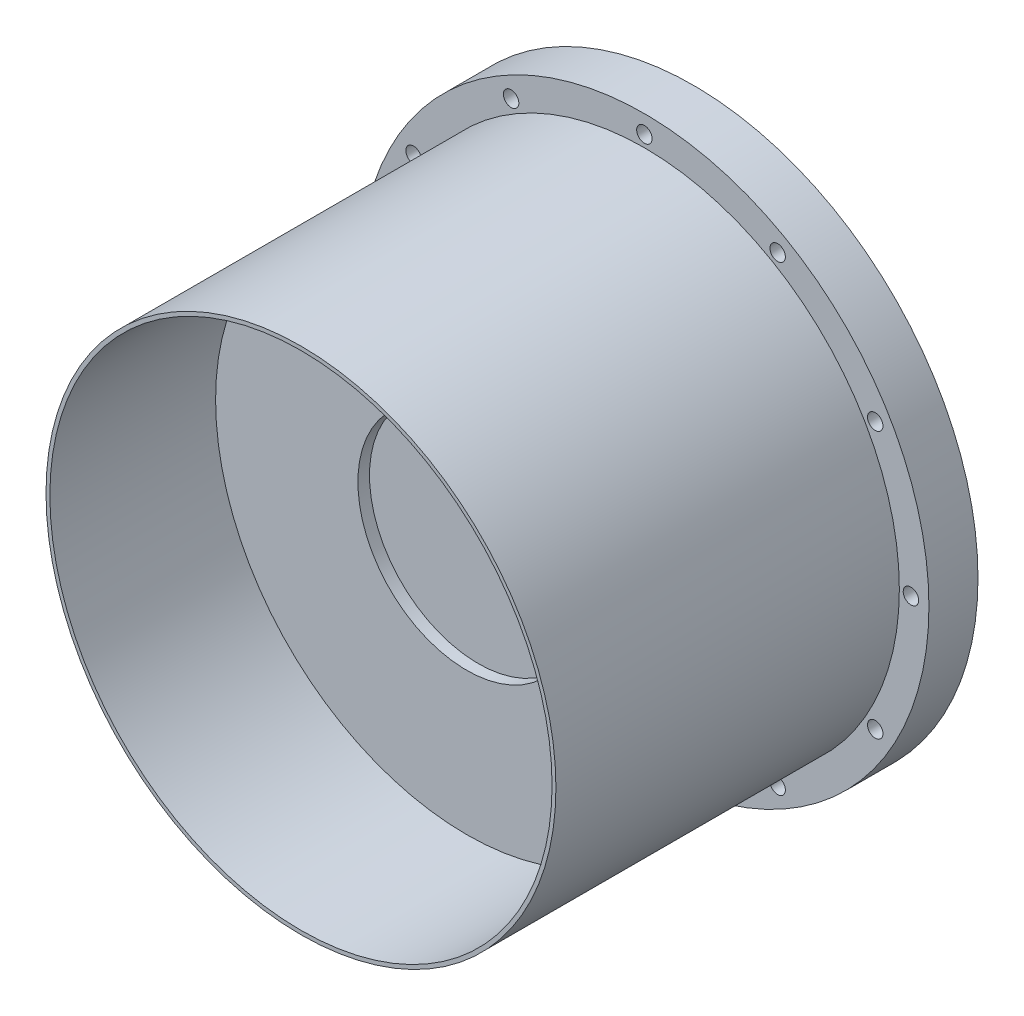
ISO-10303-21;
HEADER;
FILE_DESCRIPTION(('STEP AP214'),'2;1');
FILE_NAME('part.step','',(''),(''),'','','');
FILE_SCHEMA(('AUTOMOTIVE_DESIGN { 1 0 10303 214 1 1 1 1 }'));
ENDSEC;
DATA;
#1=APPLICATION_CONTEXT('core data for automotive mechanical design processes');
#2=APPLICATION_PROTOCOL_DEFINITION('international standard','automotive_design',2000,#1);
#3=PRODUCT_CONTEXT('',#1,'mechanical');
#4=PRODUCT('Part','Part','',(#3));
#5=PRODUCT_RELATED_PRODUCT_CATEGORY('part','',(#4));
#6=PRODUCT_DEFINITION_FORMATION('','',#4);
#7=PRODUCT_DEFINITION_CONTEXT('part definition',#1,'design');
#8=PRODUCT_DEFINITION('design','',#6,#7);
#9=PRODUCT_DEFINITION_SHAPE('','',#8);
#10=(LENGTH_UNIT() NAMED_UNIT(*) SI_UNIT(.MILLI.,.METRE.));
#11=(NAMED_UNIT(*) PLANE_ANGLE_UNIT() SI_UNIT($,.RADIAN.));
#12=(NAMED_UNIT(*) SI_UNIT($,.STERADIAN.) SOLID_ANGLE_UNIT());
#13=UNCERTAINTY_MEASURE_WITH_UNIT(LENGTH_MEASURE(1.E-05),#10,'distance_accuracy_value','');
#14=(GEOMETRIC_REPRESENTATION_CONTEXT(3) GLOBAL_UNCERTAINTY_ASSIGNED_CONTEXT((#13)) GLOBAL_UNIT_ASSIGNED_CONTEXT((#10,
#11,#12)) REPRESENTATION_CONTEXT('',''));
#15=CARTESIAN_POINT('',(0.,0.,0.));
#16=DIRECTION('',(0.,0.,1.));
#17=DIRECTION('',(1.,0.,0.));
#18=AXIS2_PLACEMENT_3D('',#15,#16,#17);
#19=CARTESIAN_POINT('',(0.,0.,12.7));
#20=DIRECTION('',(0.,0.,-1.));
#21=DIRECTION('',(-1.,0.,0.));
#22=AXIS2_PLACEMENT_3D('',#19,#20,#21);
#23=CYLINDRICAL_SURFACE('',#22,73.66);
#24=CARTESIAN_POINT('',(0.,0.,12.7));
#25=DIRECTION('',(0.,0.,1.));
#26=DIRECTION('',(1.,0.,0.));
#27=AXIS2_PLACEMENT_3D('',#24,#25,#26);
#28=CIRCLE('',#27,73.66);
#29=CARTESIAN_POINT('',(73.66,0.,12.7));
#30=VERTEX_POINT('',#29);
#31=EDGE_CURVE('E58',#30,#30,#28,.T.);
#32=ORIENTED_EDGE('',*,*,#31,.F.);
#33=EDGE_LOOP('',(#32));
#34=FACE_BOUND('',#33,.T.);
#35=CARTESIAN_POINT('',(0.,0.,0.));
#36=DIRECTION('',(0.,0.,1.));
#37=DIRECTION('',(1.,0.,0.));
#38=AXIS2_PLACEMENT_3D('',#35,#36,#37);
#39=CIRCLE('',#38,73.66);
#40=CARTESIAN_POINT('',(73.66,0.,0.));
#41=VERTEX_POINT('',#40);
#42=EDGE_CURVE('E59',#41,#41,#39,.T.);
#43=ORIENTED_EDGE('',*,*,#42,.T.);
#44=EDGE_LOOP('',(#43));
#45=FACE_BOUND('',#44,.T.);
#46=ADVANCED_FACE('F39',(#34,#45),#23,.T.);
#47=CARTESIAN_POINT('',(0.,0.,12.7));
#48=DIRECTION('',(0.,0.,1.));
#49=DIRECTION('',(1.,0.,0.));
#50=AXIS2_PLACEMENT_3D('',#47,#48,#49);
#51=PLANE('',#50);
#52=CARTESIAN_POINT('',(0.,0.,12.7));
#53=DIRECTION('',(0.,0.,1.));
#54=DIRECTION('',(1.,0.,0.));
#55=AXIS2_PLACEMENT_3D('',#52,#53,#54);
#56=CIRCLE('',#55,66.);
#57=CARTESIAN_POINT('',(66.,0.,12.7));
#58=VERTEX_POINT('',#57);
#59=EDGE_CURVE('E163',#58,#58,#56,.T.);
#60=ORIENTED_EDGE('',*,*,#59,.F.);
#61=EDGE_LOOP('',(#60));
#62=FACE_BOUND('',#61,.T.);
#63=CARTESIAN_POINT('',(0.,69.,12.7));
#64=DIRECTION('',(0.,0.,1.));
#65=DIRECTION('',(1.,0.,0.));
#66=AXIS2_PLACEMENT_3D('',#63,#64,#65);
#67=CIRCLE('',#66,2.);
#68=CARTESIAN_POINT('',(2.,69.,12.7));
#69=VERTEX_POINT('',#68);
#70=EDGE_CURVE('E100',#69,#69,#67,.T.);
#71=ORIENTED_EDGE('',*,*,#70,.F.);
#72=EDGE_LOOP('',(#71));
#73=FACE_BOUND('',#72,.T.);
#74=CARTESIAN_POINT('',(-34.4999999999992,59.7557528611267,12.7));
#75=DIRECTION('',(0.,0.,1.));
#76=DIRECTION('',(1.,0.,0.));
#77=AXIS2_PLACEMENT_3D('',#74,#75,#76);
#78=CIRCLE('',#77,2.);
#79=CARTESIAN_POINT('',(-32.4999999999992,59.7557528611267,12.7));
#80=VERTEX_POINT('',#79);
#81=EDGE_CURVE('E133',#80,#80,#78,.T.);
#82=ORIENTED_EDGE('',*,*,#81,.F.);
#83=EDGE_LOOP('',(#82));
#84=FACE_BOUND('',#83,.T.);
#85=CARTESIAN_POINT('',(-59.7557528611253,34.4999999999983,12.7));
#86=DIRECTION('',(0.,0.,1.));
#87=DIRECTION('',(1.,0.,0.));
#88=AXIS2_PLACEMENT_3D('',#85,#86,#87);
#89=CIRCLE('',#88,2.00000000000225);
#90=CARTESIAN_POINT('',(-57.7557528611231,34.4999999999983,12.7));
#91=VERTEX_POINT('',#90);
#92=EDGE_CURVE('E142',#91,#91,#89,.T.);
#93=ORIENTED_EDGE('',*,*,#92,.F.);
#94=EDGE_LOOP('',(#93));
#95=FACE_BOUND('',#94,.T.);
#96=CARTESIAN_POINT('',(-68.9999999999981,-1.95687291924082E-12,12.7));
#97=DIRECTION('',(0.,0.,1.));
#98=DIRECTION('',(1.,0.,0.));
#99=AXIS2_PLACEMENT_3D('',#96,#97,#98);
#100=CIRCLE('',#99,2.00000000000313);
#101=CARTESIAN_POINT('',(-66.9999999999949,-1.95687291924082E-12,12.7));
#102=VERTEX_POINT('',#101);
#103=EDGE_CURVE('E150',#102,#102,#100,.T.);
#104=ORIENTED_EDGE('',*,*,#103,.F.);
#105=EDGE_LOOP('',(#104));
#106=FACE_BOUND('',#105,.T.);
#107=CARTESIAN_POINT('',(34.5000000000001,59.7557528611262,12.7));
#108=DIRECTION('',(0.,0.,1.));
#109=DIRECTION('',(1.,0.,0.));
#110=AXIS2_PLACEMENT_3D('',#107,#108,#109);
#111=CIRCLE('',#110,2.);
#112=CARTESIAN_POINT('',(36.5000000000001,59.7557528611262,12.7));
#113=VERTEX_POINT('',#112);
#114=EDGE_CURVE('E92',#113,#113,#111,.T.);
#115=ORIENTED_EDGE('',*,*,#114,.F.);
#116=EDGE_LOOP('',(#115));
#117=FACE_BOUND('',#116,.T.);
#118=CARTESIAN_POINT('',(59.7557528611272,34.5000000000017,12.7));
#119=DIRECTION('',(0.,0.,1.));
#120=DIRECTION('',(1.,0.,0.));
#121=AXIS2_PLACEMENT_3D('',#118,#119,#120);
#122=CIRCLE('',#121,2.00000000000061);
#123=CARTESIAN_POINT('',(61.7557528611278,34.5000000000017,12.7));
#124=VERTEX_POINT('',#123);
#125=EDGE_CURVE('E84',#124,#124,#122,.T.);
#126=ORIENTED_EDGE('',*,*,#125,.F.);
#127=EDGE_LOOP('',(#126));
#128=FACE_BOUND('',#127,.T.);
#129=CARTESIAN_POINT('',(69.0000000000019,1.9484228563267E-12,12.7));
#130=DIRECTION('',(0.,0.,1.));
#131=DIRECTION('',(1.,0.,0.));
#132=AXIS2_PLACEMENT_3D('',#129,#130,#131);
#133=CIRCLE('',#132,2.00000000000153);
#134=CARTESIAN_POINT('',(71.0000000000035,1.9484228563267E-12,12.7));
#135=VERTEX_POINT('',#134);
#136=EDGE_CURVE('E76',#135,#135,#133,.T.);
#137=ORIENTED_EDGE('',*,*,#136,.F.);
#138=EDGE_LOOP('',(#137));
#139=FACE_BOUND('',#138,.T.);
#140=CARTESIAN_POINT('',(59.7557528611292,-34.4999999999983,12.7));
#141=DIRECTION('',(0.,0.,1.));
#142=DIRECTION('',(1.,0.,0.));
#143=AXIS2_PLACEMENT_3D('',#140,#141,#142);
#144=CIRCLE('',#143,2.00000000000263);
#145=CARTESIAN_POINT('',(61.7557528611318,-34.4999999999983,12.7));
#146=VERTEX_POINT('',#145);
#147=EDGE_CURVE('E67',#146,#146,#144,.T.);
#148=ORIENTED_EDGE('',*,*,#147,.F.);
#149=EDGE_LOOP('',(#148));
#150=FACE_BOUND('',#149,.T.);
#151=CARTESIAN_POINT('',(34.5000000000037,-59.7557528611253,12.7));
#152=DIRECTION('',(0.,0.,1.));
#153=DIRECTION('',(1.,0.,0.));
#154=AXIS2_PLACEMENT_3D('',#151,#152,#153);
#155=CIRCLE('',#154,2.0000000000036);
#156=CARTESIAN_POINT('',(36.5000000000073,-59.7557528611253,12.7));
#157=VERTEX_POINT('',#156);
#158=EDGE_CURVE('E126',#157,#157,#155,.T.);
#159=ORIENTED_EDGE('',*,*,#158,.F.);
#160=EDGE_LOOP('',(#159));
#161=FACE_BOUND('',#160,.T.);
#162=CARTESIAN_POINT('',(3.8968457126534E-12,-69.,12.7));
#163=DIRECTION('',(0.,0.,1.));
#164=DIRECTION('',(1.,0.,0.));
#165=AXIS2_PLACEMENT_3D('',#162,#163,#164);
#166=CIRCLE('',#165,2.00000000000419);
#167=CARTESIAN_POINT('',(2.00000000000808,-69.,12.7));
#168=VERTEX_POINT('',#167);
#169=EDGE_CURVE('E118',#168,#168,#166,.T.);
#170=ORIENTED_EDGE('',*,*,#169,.F.);
#171=EDGE_LOOP('',(#170));
#172=FACE_BOUND('',#171,.T.);
#173=CARTESIAN_POINT('',(-34.4999999999964,-59.7557528611273,12.7));
#174=DIRECTION('',(0.,0.,1.));
#175=DIRECTION('',(1.,0.,0.));
#176=AXIS2_PLACEMENT_3D('',#173,#174,#175);
#177=CIRCLE('',#176,2.00000000000432);
#178=CARTESIAN_POINT('',(-32.499999999992,-59.7557528611273,12.7));
#179=VERTEX_POINT('',#178);
#180=EDGE_CURVE('E110',#179,#179,#177,.T.);
#181=ORIENTED_EDGE('',*,*,#180,.F.);
#182=EDGE_LOOP('',(#181));
#183=FACE_BOUND('',#182,.T.);
#184=CARTESIAN_POINT('',(-59.7557528611233,-34.5000000000017,12.7));
#185=DIRECTION('',(0.,0.,1.));
#186=DIRECTION('',(1.,0.,0.));
#187=AXIS2_PLACEMENT_3D('',#184,#185,#186);
#188=CIRCLE('',#187,2.00000000000392);
#189=CARTESIAN_POINT('',(-57.7557528611194,-34.5000000000017,12.7));
#190=VERTEX_POINT('',#189);
#191=EDGE_CURVE('E101',#190,#190,#188,.T.);
#192=ORIENTED_EDGE('',*,*,#191,.F.);
#193=EDGE_LOOP('',(#192));
#194=FACE_BOUND('',#193,.T.);
#195=ORIENTED_EDGE('',*,*,#31,.T.);
#196=EDGE_LOOP('',(#195));
#197=FACE_BOUND('',#196,.T.);
#198=ADVANCED_FACE('F224',(#62,#73,#84,#95,#106,#117,#128,#139,#150,#161,#172,#183,#194,#197),
#51,.T.);
#199=CARTESIAN_POINT('',(0.,0.,0.));
#200=DIRECTION('',(0.,0.,1.));
#201=DIRECTION('',(1.,0.,0.));
#202=AXIS2_PLACEMENT_3D('',#199,#200,#201);
#203=PLANE('',#202);
#204=CARTESIAN_POINT('',(0.,0.,0.));
#205=DIRECTION('',(0.,0.,1.));
#206=DIRECTION('',(1.,0.,0.));
#207=AXIS2_PLACEMENT_3D('',#204,#205,#206);
#208=CIRCLE('',#207,28.1625528981699);
#209=CARTESIAN_POINT('',(28.1625528981699,0.,0.));
#210=VERTEX_POINT('',#209);
#211=EDGE_CURVE('E42',#210,#210,#208,.T.);
#212=ORIENTED_EDGE('',*,*,#211,.T.);
#213=EDGE_LOOP('',(#212));
#214=FACE_BOUND('',#213,.T.);
#215=CARTESIAN_POINT('',(0.,69.,0.));
#216=DIRECTION('',(0.,0.,1.));
#217=DIRECTION('',(1.,0.,0.));
#218=AXIS2_PLACEMENT_3D('',#215,#216,#217);
#219=CIRCLE('',#218,2.);
#220=CARTESIAN_POINT('',(2.,69.,0.));
#221=VERTEX_POINT('',#220);
#222=EDGE_CURVE('E63',#221,#221,#219,.T.);
#223=ORIENTED_EDGE('',*,*,#222,.T.);
#224=EDGE_LOOP('',(#223));
#225=FACE_BOUND('',#224,.T.);
#226=CARTESIAN_POINT('',(-34.4999999999992,59.7557528611267,0.));
#227=DIRECTION('',(0.,0.,1.));
#228=DIRECTION('',(1.,0.,0.));
#229=AXIS2_PLACEMENT_3D('',#226,#227,#228);
#230=CIRCLE('',#229,2.);
#231=CARTESIAN_POINT('',(-32.4999999999992,59.7557528611267,0.));
#232=VERTEX_POINT('',#231);
#233=EDGE_CURVE('E137',#232,#232,#230,.T.);
#234=ORIENTED_EDGE('',*,*,#233,.T.);
#235=EDGE_LOOP('',(#234));
#236=FACE_BOUND('',#235,.T.);
#237=CARTESIAN_POINT('',(-59.7557528611253,34.4999999999983,0.));
#238=DIRECTION('',(0.,0.,1.));
#239=DIRECTION('',(1.,0.,0.));
#240=AXIS2_PLACEMENT_3D('',#237,#238,#239);
#241=CIRCLE('',#240,2.00000000000225);
#242=CARTESIAN_POINT('',(-57.7557528611231,34.4999999999983,0.));
#243=VERTEX_POINT('',#242);
#244=EDGE_CURVE('E146',#243,#243,#241,.T.);
#245=ORIENTED_EDGE('',*,*,#244,.T.);
#246=EDGE_LOOP('',(#245));
#247=FACE_BOUND('',#246,.T.);
#248=CARTESIAN_POINT('',(-68.9999999999981,-1.95687291924082E-12,0.));
#249=DIRECTION('',(0.,0.,1.));
#250=DIRECTION('',(1.,0.,0.));
#251=AXIS2_PLACEMENT_3D('',#248,#249,#250);
#252=CIRCLE('',#251,2.00000000000313);
#253=CARTESIAN_POINT('',(-66.9999999999949,-1.95687291924082E-12,0.));
#254=VERTEX_POINT('',#253);
#255=EDGE_CURVE('E106',#254,#254,#252,.T.);
#256=ORIENTED_EDGE('',*,*,#255,.T.);
#257=EDGE_LOOP('',(#256));
#258=FACE_BOUND('',#257,.T.);
#259=CARTESIAN_POINT('',(34.5000000000001,59.7557528611262,0.));
#260=DIRECTION('',(0.,0.,1.));
#261=DIRECTION('',(1.,0.,0.));
#262=AXIS2_PLACEMENT_3D('',#259,#260,#261);
#263=CIRCLE('',#262,2.);
#264=CARTESIAN_POINT('',(36.5000000000001,59.7557528611262,0.));
#265=VERTEX_POINT('',#264);
#266=EDGE_CURVE('E96',#265,#265,#263,.T.);
#267=ORIENTED_EDGE('',*,*,#266,.T.);
#268=EDGE_LOOP('',(#267));
#269=FACE_BOUND('',#268,.T.);
#270=CARTESIAN_POINT('',(59.7557528611272,34.5000000000017,0.));
#271=DIRECTION('',(0.,0.,1.));
#272=DIRECTION('',(1.,0.,0.));
#273=AXIS2_PLACEMENT_3D('',#270,#271,#272);
#274=CIRCLE('',#273,2.00000000000061);
#275=CARTESIAN_POINT('',(61.7557528611278,34.5000000000017,0.));
#276=VERTEX_POINT('',#275);
#277=EDGE_CURVE('E88',#276,#276,#274,.T.);
#278=ORIENTED_EDGE('',*,*,#277,.T.);
#279=EDGE_LOOP('',(#278));
#280=FACE_BOUND('',#279,.T.);
#281=CARTESIAN_POINT('',(69.0000000000019,1.9484228563267E-12,0.));
#282=DIRECTION('',(0.,0.,1.));
#283=DIRECTION('',(1.,0.,0.));
#284=AXIS2_PLACEMENT_3D('',#281,#282,#283);
#285=CIRCLE('',#284,2.00000000000153);
#286=CARTESIAN_POINT('',(71.0000000000035,1.9484228563267E-12,0.));
#287=VERTEX_POINT('',#286);
#288=EDGE_CURVE('E80',#287,#287,#285,.T.);
#289=ORIENTED_EDGE('',*,*,#288,.T.);
#290=EDGE_LOOP('',(#289));
#291=FACE_BOUND('',#290,.T.);
#292=CARTESIAN_POINT('',(59.7557528611292,-34.4999999999983,0.));
#293=DIRECTION('',(0.,0.,1.));
#294=DIRECTION('',(1.,0.,0.));
#295=AXIS2_PLACEMENT_3D('',#292,#293,#294);
#296=CIRCLE('',#295,2.00000000000263);
#297=CARTESIAN_POINT('',(61.7557528611318,-34.4999999999983,0.));
#298=VERTEX_POINT('',#297);
#299=EDGE_CURVE('E71',#298,#298,#296,.T.);
#300=ORIENTED_EDGE('',*,*,#299,.T.);
#301=EDGE_LOOP('',(#300));
#302=FACE_BOUND('',#301,.T.);
#303=CARTESIAN_POINT('',(34.5000000000037,-59.7557528611253,0.));
#304=DIRECTION('',(0.,0.,1.));
#305=DIRECTION('',(1.,0.,0.));
#306=AXIS2_PLACEMENT_3D('',#303,#304,#305);
#307=CIRCLE('',#306,2.0000000000036);
#308=CARTESIAN_POINT('',(36.5000000000073,-59.7557528611253,0.));
#309=VERTEX_POINT('',#308);
#310=EDGE_CURVE('E72',#309,#309,#307,.T.);
#311=ORIENTED_EDGE('',*,*,#310,.T.);
#312=EDGE_LOOP('',(#311));
#313=FACE_BOUND('',#312,.T.);
#314=CARTESIAN_POINT('',(3.8968457126534E-12,-69.,0.));
#315=DIRECTION('',(0.,0.,1.));
#316=DIRECTION('',(1.,0.,0.));
#317=AXIS2_PLACEMENT_3D('',#314,#315,#316);
#318=CIRCLE('',#317,2.00000000000419);
#319=CARTESIAN_POINT('',(2.00000000000808,-69.,0.));
#320=VERTEX_POINT('',#319);
#321=EDGE_CURVE('E122',#320,#320,#318,.T.);
#322=ORIENTED_EDGE('',*,*,#321,.T.);
#323=EDGE_LOOP('',(#322));
#324=FACE_BOUND('',#323,.T.);
#325=CARTESIAN_POINT('',(-34.4999999999964,-59.7557528611273,0.));
#326=DIRECTION('',(0.,0.,1.));
#327=DIRECTION('',(1.,0.,0.));
#328=AXIS2_PLACEMENT_3D('',#325,#326,#327);
#329=CIRCLE('',#328,2.00000000000432);
#330=CARTESIAN_POINT('',(-32.499999999992,-59.7557528611273,0.));
#331=VERTEX_POINT('',#330);
#332=EDGE_CURVE('E114',#331,#331,#329,.T.);
#333=ORIENTED_EDGE('',*,*,#332,.T.);
#334=EDGE_LOOP('',(#333));
#335=FACE_BOUND('',#334,.T.);
#336=CARTESIAN_POINT('',(-59.7557528611233,-34.5000000000017,0.));
#337=DIRECTION('',(0.,0.,1.));
#338=DIRECTION('',(1.,0.,0.));
#339=AXIS2_PLACEMENT_3D('',#336,#337,#338);
#340=CIRCLE('',#339,2.00000000000392);
#341=CARTESIAN_POINT('',(-57.7557528611194,-34.5000000000017,0.));
#342=VERTEX_POINT('',#341);
#343=EDGE_CURVE('E105',#342,#342,#340,.T.);
#344=ORIENTED_EDGE('',*,*,#343,.T.);
#345=EDGE_LOOP('',(#344));
#346=FACE_BOUND('',#345,.T.);
#347=ORIENTED_EDGE('',*,*,#42,.F.);
#348=EDGE_LOOP('',(#347));
#349=FACE_BOUND('',#348,.T.);
#350=ADVANCED_FACE('F207',(#214,#225,#236,#247,#258,#269,#280,#291,#302,#313,#324,#335,#346,
#349),#203,.F.);
#351=CARTESIAN_POINT('',(-59.7557528611233,-34.5000000000017,0.));
#352=DIRECTION('',(0.,0.,1.));
#353=DIRECTION('',(1.,0.,0.));
#354=AXIS2_PLACEMENT_3D('',#351,#352,#353);
#355=CYLINDRICAL_SURFACE('',#354,2.00000000000392);
#356=ORIENTED_EDGE('',*,*,#343,.F.);
#357=EDGE_LOOP('',(#356));
#358=FACE_BOUND('',#357,.T.);
#359=ORIENTED_EDGE('',*,*,#191,.T.);
#360=EDGE_LOOP('',(#359));
#361=FACE_BOUND('',#360,.T.);
#362=ADVANCED_FACE('F237',(#358,#361),#355,.F.);
#363=CARTESIAN_POINT('',(-34.4999999999964,-59.7557528611273,0.));
#364=DIRECTION('',(0.,0.,1.));
#365=DIRECTION('',(1.,0.,0.));
#366=AXIS2_PLACEMENT_3D('',#363,#364,#365);
#367=CYLINDRICAL_SURFACE('',#366,2.00000000000432);
#368=ORIENTED_EDGE('',*,*,#332,.F.);
#369=EDGE_LOOP('',(#368));
#370=FACE_BOUND('',#369,.T.);
#371=ORIENTED_EDGE('',*,*,#180,.T.);
#372=EDGE_LOOP('',(#371));
#373=FACE_BOUND('',#372,.T.);
#374=ADVANCED_FACE('F241',(#370,#373),#367,.F.);
#375=CARTESIAN_POINT('',(3.8968457126534E-12,-69.,0.));
#376=DIRECTION('',(0.,0.,1.));
#377=DIRECTION('',(1.,0.,0.));
#378=AXIS2_PLACEMENT_3D('',#375,#376,#377);
#379=CYLINDRICAL_SURFACE('',#378,2.00000000000419);
#380=ORIENTED_EDGE('',*,*,#321,.F.);
#381=EDGE_LOOP('',(#380));
#382=FACE_BOUND('',#381,.T.);
#383=ORIENTED_EDGE('',*,*,#169,.T.);
#384=EDGE_LOOP('',(#383));
#385=FACE_BOUND('',#384,.T.);
#386=ADVANCED_FACE('F265',(#382,#385),#379,.F.);
#387=CARTESIAN_POINT('',(34.5000000000037,-59.7557528611253,0.));
#388=DIRECTION('',(0.,0.,1.));
#389=DIRECTION('',(1.,0.,0.));
#390=AXIS2_PLACEMENT_3D('',#387,#388,#389);
#391=CYLINDRICAL_SURFACE('',#390,2.0000000000036);
#392=ORIENTED_EDGE('',*,*,#310,.F.);
#393=EDGE_LOOP('',(#392));
#394=FACE_BOUND('',#393,.T.);
#395=ORIENTED_EDGE('',*,*,#158,.T.);
#396=EDGE_LOOP('',(#395));
#397=FACE_BOUND('',#396,.T.);
#398=ADVANCED_FACE('F249',(#394,#397),#391,.F.);
#399=CARTESIAN_POINT('',(59.7557528611292,-34.4999999999983,0.));
#400=DIRECTION('',(0.,0.,1.));
#401=DIRECTION('',(1.,0.,0.));
#402=AXIS2_PLACEMENT_3D('',#399,#400,#401);
#403=CYLINDRICAL_SURFACE('',#402,2.00000000000263);
#404=ORIENTED_EDGE('',*,*,#299,.F.);
#405=EDGE_LOOP('',(#404));
#406=FACE_BOUND('',#405,.T.);
#407=ORIENTED_EDGE('',*,*,#147,.T.);
#408=EDGE_LOOP('',(#407));
#409=FACE_BOUND('',#408,.T.);
#410=ADVANCED_FACE('F245',(#406,#409),#403,.F.);
#411=CARTESIAN_POINT('',(69.0000000000019,1.9484228563267E-12,0.));
#412=DIRECTION('',(0.,0.,1.));
#413=DIRECTION('',(1.,0.,0.));
#414=AXIS2_PLACEMENT_3D('',#411,#412,#413);
#415=CYLINDRICAL_SURFACE('',#414,2.00000000000153);
#416=ORIENTED_EDGE('',*,*,#288,.F.);
#417=EDGE_LOOP('',(#416));
#418=FACE_BOUND('',#417,.T.);
#419=ORIENTED_EDGE('',*,*,#136,.T.);
#420=EDGE_LOOP('',(#419));
#421=FACE_BOUND('',#420,.T.);
#422=ADVANCED_FACE('F248',(#418,#421),#415,.F.);
#423=CARTESIAN_POINT('',(59.7557528611272,34.5000000000017,0.));
#424=DIRECTION('',(0.,0.,1.));
#425=DIRECTION('',(1.,0.,0.));
#426=AXIS2_PLACEMENT_3D('',#423,#424,#425);
#427=CYLINDRICAL_SURFACE('',#426,2.00000000000061);
#428=ORIENTED_EDGE('',*,*,#277,.F.);
#429=EDGE_LOOP('',(#428));
#430=FACE_BOUND('',#429,.T.);
#431=ORIENTED_EDGE('',*,*,#125,.T.);
#432=EDGE_LOOP('',(#431));
#433=FACE_BOUND('',#432,.T.);
#434=ADVANCED_FACE('F253',(#430,#433),#427,.F.);
#435=CARTESIAN_POINT('',(34.5000000000001,59.7557528611262,0.));
#436=DIRECTION('',(0.,0.,1.));
#437=DIRECTION('',(1.,0.,0.));
#438=AXIS2_PLACEMENT_3D('',#435,#436,#437);
#439=CYLINDRICAL_SURFACE('',#438,2.);
#440=ORIENTED_EDGE('',*,*,#266,.F.);
#441=EDGE_LOOP('',(#440));
#442=FACE_BOUND('',#441,.T.);
#443=ORIENTED_EDGE('',*,*,#114,.T.);
#444=EDGE_LOOP('',(#443));
#445=FACE_BOUND('',#444,.T.);
#446=ADVANCED_FACE('F257',(#442,#445),#439,.F.);
#447=CARTESIAN_POINT('',(-68.9999999999981,-1.95687291924082E-12,0.));
#448=DIRECTION('',(0.,0.,1.));
#449=DIRECTION('',(1.,0.,0.));
#450=AXIS2_PLACEMENT_3D('',#447,#448,#449);
#451=CYLINDRICAL_SURFACE('',#450,2.00000000000313);
#452=ORIENTED_EDGE('',*,*,#255,.F.);
#453=EDGE_LOOP('',(#452));
#454=FACE_BOUND('',#453,.T.);
#455=ORIENTED_EDGE('',*,*,#103,.T.);
#456=EDGE_LOOP('',(#455));
#457=FACE_BOUND('',#456,.T.);
#458=ADVANCED_FACE('F260',(#454,#457),#451,.F.);
#459=CARTESIAN_POINT('',(-59.7557528611253,34.4999999999983,0.));
#460=DIRECTION('',(0.,0.,1.));
#461=DIRECTION('',(1.,0.,0.));
#462=AXIS2_PLACEMENT_3D('',#459,#460,#461);
#463=CYLINDRICAL_SURFACE('',#462,2.00000000000225);
#464=ORIENTED_EDGE('',*,*,#244,.F.);
#465=EDGE_LOOP('',(#464));
#466=FACE_BOUND('',#465,.T.);
#467=ORIENTED_EDGE('',*,*,#92,.T.);
#468=EDGE_LOOP('',(#467));
#469=FACE_BOUND('',#468,.T.);
#470=ADVANCED_FACE('F277',(#466,#469),#463,.F.);
#471=CARTESIAN_POINT('',(-34.4999999999992,59.7557528611267,0.));
#472=DIRECTION('',(0.,0.,1.));
#473=DIRECTION('',(1.,0.,0.));
#474=AXIS2_PLACEMENT_3D('',#471,#472,#473);
#475=CYLINDRICAL_SURFACE('',#474,2.);
#476=ORIENTED_EDGE('',*,*,#233,.F.);
#477=EDGE_LOOP('',(#476));
#478=FACE_BOUND('',#477,.T.);
#479=ORIENTED_EDGE('',*,*,#81,.T.);
#480=EDGE_LOOP('',(#479));
#481=FACE_BOUND('',#480,.T.);
#482=ADVANCED_FACE('F273',(#478,#481),#475,.F.);
#483=CARTESIAN_POINT('',(0.,69.,0.));
#484=DIRECTION('',(0.,0.,1.));
#485=DIRECTION('',(1.,0.,0.));
#486=AXIS2_PLACEMENT_3D('',#483,#484,#485);
#487=CYLINDRICAL_SURFACE('',#486,2.);
#488=ORIENTED_EDGE('',*,*,#222,.F.);
#489=EDGE_LOOP('',(#488));
#490=FACE_BOUND('',#489,.T.);
#491=ORIENTED_EDGE('',*,*,#70,.T.);
#492=EDGE_LOOP('',(#491));
#493=FACE_BOUND('',#492,.T.);
#494=ADVANCED_FACE('F276',(#490,#493),#487,.F.);
#495=CARTESIAN_POINT('',(0.,0.,101.6));
#496=DIRECTION('',(0.,0.,1.));
#497=DIRECTION('',(1.,0.,0.));
#498=AXIS2_PLACEMENT_3D('',#495,#496,#497);
#499=PLANE('',#498);
#500=CARTESIAN_POINT('',(0.,0.,101.6));
#501=DIRECTION('',(0.,0.,1.));
#502=DIRECTION('',(1.,0.,0.));
#503=AXIS2_PLACEMENT_3D('',#500,#501,#502);
#504=CIRCLE('',#503,66.);
#505=CARTESIAN_POINT('',(66.,0.,101.6));
#506=VERTEX_POINT('',#505);
#507=EDGE_CURVE('E138',#506,#506,#504,.T.);
#508=ORIENTED_EDGE('',*,*,#507,.T.);
#509=EDGE_LOOP('',(#508));
#510=FACE_BOUND('',#509,.T.);
#511=CARTESIAN_POINT('',(0.,0.,101.6));
#512=DIRECTION('',(0.,0.,1.));
#513=DIRECTION('',(1.,0.,0.));
#514=AXIS2_PLACEMENT_3D('',#511,#512,#513);
#515=CIRCLE('',#514,65.);
#516=CARTESIAN_POINT('',(65.,0.,101.6));
#517=VERTEX_POINT('',#516);
#518=EDGE_CURVE('E167',#517,#517,#515,.T.);
#519=ORIENTED_EDGE('',*,*,#518,.F.);
#520=EDGE_LOOP('',(#519));
#521=FACE_BOUND('',#520,.T.);
#522=ADVANCED_FACE('F287',(#510,#521),#499,.T.);
#523=CARTESIAN_POINT('',(0.,0.,101.6));
#524=DIRECTION('',(0.,0.,-1.));
#525=DIRECTION('',(-1.,0.,0.));
#526=AXIS2_PLACEMENT_3D('',#523,#524,#525);
#527=CYLINDRICAL_SURFACE('',#526,66.);
#528=ORIENTED_EDGE('',*,*,#507,.F.);
#529=EDGE_LOOP('',(#528));
#530=FACE_BOUND('',#529,.T.);
#531=ORIENTED_EDGE('',*,*,#59,.T.);
#532=EDGE_LOOP('',(#531));
#533=FACE_BOUND('',#532,.T.);
#534=ADVANCED_FACE('F289',(#530,#533),#527,.T.);
#535=CARTESIAN_POINT('',(0.,0.,101.6));
#536=DIRECTION('',(0.,0.,-1.));
#537=DIRECTION('',(-1.,0.,0.));
#538=AXIS2_PLACEMENT_3D('',#535,#536,#537);
#539=CYLINDRICAL_SURFACE('',#538,65.);
#540=CARTESIAN_POINT('',(0.,0.,58.7));
#541=DIRECTION('',(0.,0.,1.));
#542=DIRECTION('',(1.,0.,0.));
#543=AXIS2_PLACEMENT_3D('',#540,#541,#542);
#544=CIRCLE('',#543,65.);
#545=CARTESIAN_POINT('',(65.,0.,58.7));
#546=VERTEX_POINT('',#545);
#547=EDGE_CURVE('E10',#546,#546,#544,.T.);
#548=ORIENTED_EDGE('',*,*,#547,.F.);
#549=EDGE_LOOP('',(#548));
#550=FACE_BOUND('',#549,.T.);
#551=ORIENTED_EDGE('',*,*,#518,.T.);
#552=EDGE_LOOP('',(#551));
#553=FACE_BOUND('',#552,.T.);
#554=ADVANCED_FACE('F221',(#550,#553),#539,.F.);
#555=CARTESIAN_POINT('',(0.,0.,58.7));
#556=DIRECTION('',(0.,0.,1.));
#557=DIRECTION('',(1.,0.,0.));
#558=AXIS2_PLACEMENT_3D('',#555,#556,#557);
#559=PLANE('',#558);
#560=ORIENTED_EDGE('',*,*,#547,.T.);
#561=EDGE_LOOP('',(#560));
#562=FACE_BOUND('',#561,.T.);
#563=CARTESIAN_POINT('',(0.,0.,58.7));
#564=DIRECTION('',(0.,0.,1.));
#565=DIRECTION('',(1.,0.,0.));
#566=AXIS2_PLACEMENT_3D('',#563,#564,#565);
#567=CIRCLE('',#566,28.1625528981699);
#568=CARTESIAN_POINT('',(28.1625528981699,0.,58.7));
#569=VERTEX_POINT('',#568);
#570=EDGE_CURVE('E190',#569,#569,#567,.T.);
#571=ORIENTED_EDGE('',*,*,#570,.F.);
#572=EDGE_LOOP('',(#571));
#573=FACE_BOUND('',#572,.T.);
#574=ADVANCED_FACE('F297',(#562,#573),#559,.T.);
#575=CARTESIAN_POINT('',(0.,0.,55.7));
#576=DIRECTION('',(0.,0.,1.));
#577=DIRECTION('',(1.,0.,0.));
#578=AXIS2_PLACEMENT_3D('',#575,#576,#577);
#579=PLANE('',#578);
#580=CARTESIAN_POINT('',(0.,0.,55.7));
#581=DIRECTION('',(0.,0.,1.));
#582=DIRECTION('',(1.,0.,0.));
#583=AXIS2_PLACEMENT_3D('',#580,#581,#582);
#584=CIRCLE('',#583,65.);
#585=CARTESIAN_POINT('',(65.,0.,55.7));
#586=VERTEX_POINT('',#585);
#587=EDGE_CURVE('E183',#586,#586,#584,.T.);
#588=ORIENTED_EDGE('',*,*,#587,.F.);
#589=EDGE_LOOP('',(#588));
#590=FACE_BOUND('',#589,.T.);
#591=CARTESIAN_POINT('',(0.,0.,55.7));
#592=DIRECTION('',(0.,0.,1.));
#593=DIRECTION('',(1.,0.,0.));
#594=AXIS2_PLACEMENT_3D('',#591,#592,#593);
#595=CIRCLE('',#594,28.1625528981699);
#596=CARTESIAN_POINT('',(28.1625528981699,0.,55.7));
#597=VERTEX_POINT('',#596);
#598=EDGE_CURVE('E191',#597,#597,#595,.T.);
#599=ORIENTED_EDGE('',*,*,#598,.T.);
#600=EDGE_LOOP('',(#599));
#601=FACE_BOUND('',#600,.T.);
#602=ADVANCED_FACE('F310',(#590,#601),#579,.F.);
#603=CARTESIAN_POINT('',(0.,0.,58.7));
#604=DIRECTION('',(0.,0.,-1.));
#605=DIRECTION('',(-1.,0.,0.));
#606=AXIS2_PLACEMENT_3D('',#603,#604,#605);
#607=CYLINDRICAL_SURFACE('',#606,28.1625528981699);
#608=ORIENTED_EDGE('',*,*,#570,.T.);
#609=EDGE_LOOP('',(#608));
#610=FACE_BOUND('',#609,.T.);
#611=ORIENTED_EDGE('',*,*,#598,.F.);
#612=EDGE_LOOP('',(#611));
#613=FACE_BOUND('',#612,.T.);
#614=ADVANCED_FACE('F313',(#610,#613),#607,.F.);
#615=CARTESIAN_POINT('',(0.,0.,12.7));
#616=DIRECTION('',(0.,0.,1.));
#617=DIRECTION('',(1.,0.,0.));
#618=AXIS2_PLACEMENT_3D('',#615,#616,#617);
#619=CIRCLE('',#618,28.1625528981699);
#620=CARTESIAN_POINT('',(28.1625528981699,0.,12.7));
#621=VERTEX_POINT('',#620);
#622=EDGE_CURVE('E198',#621,#621,#619,.T.);
#623=ORIENTED_EDGE('',*,*,#622,.F.);
#624=EDGE_LOOP('',(#623));
#625=FACE_BOUND('',#624,.T.);
#626=CARTESIAN_POINT('',(0.,0.,12.7));
#627=DIRECTION('',(0.,0.,1.));
#628=DIRECTION('',(1.,0.,0.));
#629=AXIS2_PLACEMENT_3D('',#626,#627,#628);
#630=CIRCLE('',#629,65.);
#631=CARTESIAN_POINT('',(65.,0.,12.7));
#632=VERTEX_POINT('',#631);
#633=EDGE_CURVE('E52',#632,#632,#630,.F.);
#634=ORIENTED_EDGE('',*,*,#633,.F.);
#635=EDGE_LOOP('',(#634));
#636=FACE_BOUND('',#635,.T.);
#637=ADVANCED_FACE('F231',(#625,#636),#51,.T.);
#638=ORIENTED_EDGE('',*,*,#633,.T.);
#639=EDGE_LOOP('',(#638));
#640=FACE_BOUND('',#639,.T.);
#641=CARTESIAN_POINT('',(0.,0.,32.7));
#642=DIRECTION('',(0.,0.,1.));
#643=DIRECTION('',(1.,0.,0.));
#644=AXIS2_PLACEMENT_3D('',#641,#642,#643);
#645=CIRCLE('',#644,65.);
#646=CARTESIAN_POINT('',(65.,0.,32.7));
#647=VERTEX_POINT('',#646);
#648=EDGE_CURVE('E174',#647,#647,#645,.T.);
#649=ORIENTED_EDGE('',*,*,#648,.T.);
#650=EDGE_LOOP('',(#649));
#651=FACE_BOUND('',#650,.T.);
#652=ADVANCED_FACE('F220',(#640,#651),#539,.F.);
#653=CARTESIAN_POINT('',(0.,0.,32.7));
#654=DIRECTION('',(0.,0.,1.));
#655=DIRECTION('',(1.,0.,0.));
#656=AXIS2_PLACEMENT_3D('',#653,#654,#655);
#657=PLANE('',#656);
#658=ORIENTED_EDGE('',*,*,#648,.F.);
#659=EDGE_LOOP('',(#658));
#660=FACE_BOUND('',#659,.T.);
#661=CARTESIAN_POINT('',(0.,0.,32.7));
#662=DIRECTION('',(0.,0.,1.));
#663=DIRECTION('',(1.,0.,0.));
#664=AXIS2_PLACEMENT_3D('',#661,#662,#663);
#665=CIRCLE('',#664,28.1625528981699);
#666=CARTESIAN_POINT('',(28.1625528981699,0.,32.7));
#667=VERTEX_POINT('',#666);
#668=EDGE_CURVE('E179',#667,#667,#665,.T.);
#669=ORIENTED_EDGE('',*,*,#668,.T.);
#670=EDGE_LOOP('',(#669));
#671=FACE_BOUND('',#670,.T.);
#672=ADVANCED_FACE('F299',(#660,#671),#657,.F.);
#673=CARTESIAN_POINT('',(0.,0.,35.7));
#674=DIRECTION('',(0.,0.,-1.));
#675=DIRECTION('',(-1.,0.,0.));
#676=AXIS2_PLACEMENT_3D('',#673,#674,#675);
#677=CYLINDRICAL_SURFACE('',#676,28.1625528981699);
#678=CARTESIAN_POINT('',(0.,0.,35.7));
#679=DIRECTION('',(0.,0.,1.));
#680=DIRECTION('',(1.,0.,0.));
#681=AXIS2_PLACEMENT_3D('',#678,#679,#680);
#682=CIRCLE('',#681,28.1625528981699);
#683=CARTESIAN_POINT('',(28.1625528981699,0.,35.7));
#684=VERTEX_POINT('',#683);
#685=EDGE_CURVE('E178',#684,#684,#682,.T.);
#686=ORIENTED_EDGE('',*,*,#685,.T.);
#687=EDGE_LOOP('',(#686));
#688=FACE_BOUND('',#687,.T.);
#689=ORIENTED_EDGE('',*,*,#668,.F.);
#690=EDGE_LOOP('',(#689));
#691=FACE_BOUND('',#690,.T.);
#692=ADVANCED_FACE('F302',(#688,#691),#677,.F.);
#693=CARTESIAN_POINT('',(0.,0.,35.7));
#694=DIRECTION('',(0.,0.,1.));
#695=DIRECTION('',(1.,0.,0.));
#696=AXIS2_PLACEMENT_3D('',#693,#694,#695);
#697=PLANE('',#696);
#698=CARTESIAN_POINT('',(0.,0.,35.7));
#699=DIRECTION('',(0.,0.,1.));
#700=DIRECTION('',(1.,0.,0.));
#701=AXIS2_PLACEMENT_3D('',#698,#699,#700);
#702=CIRCLE('',#701,65.);
#703=CARTESIAN_POINT('',(65.,0.,35.7));
#704=VERTEX_POINT('',#703);
#705=EDGE_CURVE('E47',#704,#704,#702,.T.);
#706=ORIENTED_EDGE('',*,*,#705,.T.);
#707=EDGE_LOOP('',(#706));
#708=FACE_BOUND('',#707,.T.);
#709=ORIENTED_EDGE('',*,*,#685,.F.);
#710=EDGE_LOOP('',(#709));
#711=FACE_BOUND('',#710,.T.);
#712=ADVANCED_FACE('F217',(#708,#711),#697,.T.);
#713=ORIENTED_EDGE('',*,*,#705,.F.);
#714=EDGE_LOOP('',(#713));
#715=FACE_BOUND('',#714,.T.);
#716=ORIENTED_EDGE('',*,*,#587,.T.);
#717=EDGE_LOOP('',(#716));
#718=FACE_BOUND('',#717,.T.);
#719=ADVANCED_FACE('F212',(#715,#718),#539,.F.);
#720=CARTESIAN_POINT('',(0.,0.,-287.3));
#721=DIRECTION('',(0.,0.,1.));
#722=DIRECTION('',(1.,0.,0.));
#723=AXIS2_PLACEMENT_3D('',#720,#721,#722);
#724=CYLINDRICAL_SURFACE('',#723,28.1625528981699);
#725=ORIENTED_EDGE('',*,*,#622,.T.);
#726=EDGE_LOOP('',(#725));
#727=FACE_BOUND('',#726,.T.);
#728=ORIENTED_EDGE('',*,*,#211,.F.);
#729=EDGE_LOOP('',(#728));
#730=FACE_BOUND('',#729,.T.);
#731=ADVANCED_FACE('F210',(#727,#730),#724,.F.);
#732=CLOSED_SHELL('',(#46,#198,#350,#362,#374,#386,#398,#410,#422,#434,#446,#458,#470,#482,#494,
#522,#534,#554,#574,#602,#614,#637,#652,#672,#692,#712,#719,#731));
#733=MANIFOLD_SOLID_BREP('B2',#732);
#734=ADVANCED_BREP_SHAPE_REPRESENTATION('',(#18,#733),#14);
#735=SHAPE_DEFINITION_REPRESENTATION(#9,#734);
ENDSEC;
END-ISO-10303-21;
